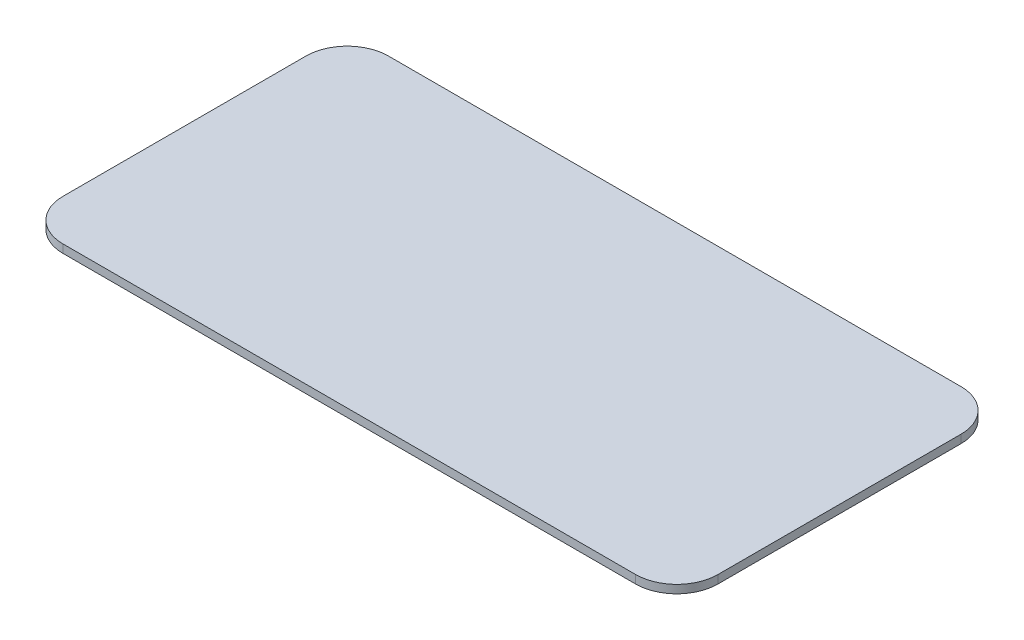
ISO-10303-21;
HEADER;
FILE_DESCRIPTION(('STEP AP214'),'2;1');
FILE_NAME('part.step','',(''),(''),'','','');
FILE_SCHEMA(('AUTOMOTIVE_DESIGN { 1 0 10303 214 1 1 1 1 }'));
ENDSEC;
DATA;
#1=APPLICATION_CONTEXT('core data for automotive mechanical design processes');
#2=APPLICATION_PROTOCOL_DEFINITION('international standard','automotive_design',2000,#1);
#3=PRODUCT_CONTEXT('',#1,'mechanical');
#4=PRODUCT('Part','Part','',(#3));
#5=PRODUCT_RELATED_PRODUCT_CATEGORY('part','',(#4));
#6=PRODUCT_DEFINITION_FORMATION('','',#4);
#7=PRODUCT_DEFINITION_CONTEXT('part definition',#1,'design');
#8=PRODUCT_DEFINITION('design','',#6,#7);
#9=PRODUCT_DEFINITION_SHAPE('','',#8);
#10=(LENGTH_UNIT() NAMED_UNIT(*) SI_UNIT(.MILLI.,.METRE.));
#11=(NAMED_UNIT(*) PLANE_ANGLE_UNIT() SI_UNIT($,.RADIAN.));
#12=(NAMED_UNIT(*) SI_UNIT($,.STERADIAN.) SOLID_ANGLE_UNIT());
#13=UNCERTAINTY_MEASURE_WITH_UNIT(LENGTH_MEASURE(1.E-05),#10,'distance_accuracy_value','');
#14=(GEOMETRIC_REPRESENTATION_CONTEXT(3) GLOBAL_UNCERTAINTY_ASSIGNED_CONTEXT((#13)) GLOBAL_UNIT_ASSIGNED_CONTEXT((#10,
#11,#12)) REPRESENTATION_CONTEXT('',''));
#15=CARTESIAN_POINT('',(0.,0.,0.));
#16=DIRECTION('',(0.,0.,1.));
#17=DIRECTION('',(1.,0.,0.));
#18=AXIS2_PLACEMENT_3D('',#15,#16,#17);
#19=CARTESIAN_POINT('',(-6.95,0.2,2.95));
#20=DIRECTION('',(0.,-1.,0.));
#21=DIRECTION('',(0.,0.,-1.));
#22=AXIS2_PLACEMENT_3D('',#19,#20,#21);
#23=CYLINDRICAL_SURFACE('',#22,1.);
#24=CARTESIAN_POINT('',(-6.95,0.2,2.95));
#25=DIRECTION('',(0.,1.,0.));
#26=DIRECTION('',(0.,0.,-1.));
#27=AXIS2_PLACEMENT_3D('',#24,#25,#26);
#28=CIRCLE('',#27,1.);
#29=CARTESIAN_POINT('',(-7.95,0.2,2.95));
#30=VERTEX_POINT('',#29);
#31=CARTESIAN_POINT('',(-6.95,0.2,3.95));
#32=VERTEX_POINT('',#31);
#33=EDGE_CURVE('E42',#30,#32,#28,.T.);
#34=ORIENTED_EDGE('',*,*,#33,.F.);
#35=DIRECTION('',(0.,1.,0.));
#36=VECTOR('',#35,1.);
#37=CARTESIAN_POINT('',(-7.95,0.2,2.95));
#38=LINE('',#37,#36);
#39=CARTESIAN_POINT('',(-7.95,0.,2.95));
#40=VERTEX_POINT('',#39);
#41=EDGE_CURVE('E107',#40,#30,#38,.T.);
#42=ORIENTED_EDGE('',*,*,#41,.F.);
#43=CARTESIAN_POINT('',(-6.95,0.,2.95));
#44=DIRECTION('',(0.,-1.,0.));
#45=DIRECTION('',(0.,0.,-1.));
#46=AXIS2_PLACEMENT_3D('',#43,#44,#45);
#47=CIRCLE('',#46,1.);
#48=CARTESIAN_POINT('',(-6.95,0.,3.95));
#49=VERTEX_POINT('',#48);
#50=EDGE_CURVE('E102',#49,#40,#47,.T.);
#51=ORIENTED_EDGE('',*,*,#50,.F.);
#52=DIRECTION('',(0.,-1.,0.));
#53=VECTOR('',#52,1.);
#54=CARTESIAN_POINT('',(-6.95,0.2,3.95));
#55=LINE('',#54,#53);
#56=EDGE_CURVE('E104',#32,#49,#55,.T.);
#57=ORIENTED_EDGE('',*,*,#56,.F.);
#58=EDGE_LOOP('',(#34,#42,#51,#57));
#59=FACE_BOUND('',#58,.T.);
#60=ADVANCED_FACE('F16',(#59),#23,.T.);
#61=CARTESIAN_POINT('',(-6.95,0.2,-2.95));
#62=DIRECTION('',(0.,-1.,0.));
#63=DIRECTION('',(0.,0.,-1.));
#64=AXIS2_PLACEMENT_3D('',#61,#62,#63);
#65=CYLINDRICAL_SURFACE('',#64,1.);
#66=CARTESIAN_POINT('',(-6.95,0.2,-2.95));
#67=DIRECTION('',(0.,1.,0.));
#68=DIRECTION('',(0.,0.,-1.));
#69=AXIS2_PLACEMENT_3D('',#66,#67,#68);
#70=CIRCLE('',#69,1.);
#71=CARTESIAN_POINT('',(-6.95,0.2,-3.95));
#72=VERTEX_POINT('',#71);
#73=CARTESIAN_POINT('',(-7.95,0.2,-2.95));
#74=VERTEX_POINT('',#73);
#75=EDGE_CURVE('E80',#72,#74,#70,.T.);
#76=ORIENTED_EDGE('',*,*,#75,.F.);
#77=DIRECTION('',(0.,1.,0.));
#78=VECTOR('',#77,1.);
#79=CARTESIAN_POINT('',(-6.95,0.2,-3.95));
#80=LINE('',#79,#78);
#81=CARTESIAN_POINT('',(-6.95,0.,-3.95));
#82=VERTEX_POINT('',#81);
#83=EDGE_CURVE('E137',#82,#72,#80,.T.);
#84=ORIENTED_EDGE('',*,*,#83,.F.);
#85=CARTESIAN_POINT('',(-6.95,0.,-2.95));
#86=DIRECTION('',(0.,-1.,0.));
#87=DIRECTION('',(0.,0.,-1.));
#88=AXIS2_PLACEMENT_3D('',#85,#86,#87);
#89=CIRCLE('',#88,1.);
#90=CARTESIAN_POINT('',(-7.95,0.,-2.95));
#91=VERTEX_POINT('',#90);
#92=EDGE_CURVE('E27',#91,#82,#89,.T.);
#93=ORIENTED_EDGE('',*,*,#92,.F.);
#94=DIRECTION('',(0.,-1.,0.));
#95=VECTOR('',#94,1.);
#96=CARTESIAN_POINT('',(-7.95,0.2,-2.95));
#97=LINE('',#96,#95);
#98=EDGE_CURVE('E159',#74,#91,#97,.T.);
#99=ORIENTED_EDGE('',*,*,#98,.F.);
#100=EDGE_LOOP('',(#76,#84,#93,#99));
#101=FACE_BOUND('',#100,.T.);
#102=ADVANCED_FACE('F328',(#101),#65,.T.);
#103=CARTESIAN_POINT('',(6.95,0.2,-2.95));
#104=DIRECTION('',(0.,-1.,0.));
#105=DIRECTION('',(0.,0.,-1.));
#106=AXIS2_PLACEMENT_3D('',#103,#104,#105);
#107=CYLINDRICAL_SURFACE('',#106,1.);
#108=CARTESIAN_POINT('',(6.95,0.2,-2.95));
#109=DIRECTION('',(0.,1.,0.));
#110=DIRECTION('',(0.,0.,-1.));
#111=AXIS2_PLACEMENT_3D('',#108,#109,#110);
#112=CIRCLE('',#111,1.);
#113=CARTESIAN_POINT('',(7.95,0.2,-2.95));
#114=VERTEX_POINT('',#113);
#115=CARTESIAN_POINT('',(6.95,0.2,-3.95));
#116=VERTEX_POINT('',#115);
#117=EDGE_CURVE('E166',#114,#116,#112,.T.);
#118=ORIENTED_EDGE('',*,*,#117,.F.);
#119=DIRECTION('',(0.,1.,0.));
#120=VECTOR('',#119,1.);
#121=CARTESIAN_POINT('',(7.95,0.2,-2.95));
#122=LINE('',#121,#120);
#123=CARTESIAN_POINT('',(7.95,0.,-2.95));
#124=VERTEX_POINT('',#123);
#125=EDGE_CURVE('E143',#124,#114,#122,.T.);
#126=ORIENTED_EDGE('',*,*,#125,.F.);
#127=CARTESIAN_POINT('',(6.95,0.,-2.95));
#128=DIRECTION('',(0.,-1.,0.));
#129=DIRECTION('',(0.,0.,-1.));
#130=AXIS2_PLACEMENT_3D('',#127,#128,#129);
#131=CIRCLE('',#130,1.);
#132=CARTESIAN_POINT('',(6.95,0.,-3.95));
#133=VERTEX_POINT('',#132);
#134=EDGE_CURVE('E11',#133,#124,#131,.T.);
#135=ORIENTED_EDGE('',*,*,#134,.F.);
#136=DIRECTION('',(0.,-1.,0.));
#137=VECTOR('',#136,1.);
#138=CARTESIAN_POINT('',(6.95,0.2,-3.95));
#139=LINE('',#138,#137);
#140=EDGE_CURVE('E153',#116,#133,#139,.T.);
#141=ORIENTED_EDGE('',*,*,#140,.F.);
#142=EDGE_LOOP('',(#118,#126,#135,#141));
#143=FACE_BOUND('',#142,.T.);
#144=ADVANCED_FACE('F317',(#143),#107,.T.);
#145=CARTESIAN_POINT('',(6.95,0.2,2.95));
#146=DIRECTION('',(0.,-1.,0.));
#147=DIRECTION('',(0.,0.,-1.));
#148=AXIS2_PLACEMENT_3D('',#145,#146,#147);
#149=CYLINDRICAL_SURFACE('',#148,1.);
#150=CARTESIAN_POINT('',(6.95,0.2,2.95));
#151=DIRECTION('',(0.,1.,0.));
#152=DIRECTION('',(0.,0.,-1.));
#153=AXIS2_PLACEMENT_3D('',#150,#151,#152);
#154=CIRCLE('',#153,1.);
#155=CARTESIAN_POINT('',(6.95,0.2,3.95));
#156=VERTEX_POINT('',#155);
#157=CARTESIAN_POINT('',(7.95,0.2,2.95));
#158=VERTEX_POINT('',#157);
#159=EDGE_CURVE('E120',#156,#158,#154,.T.);
#160=ORIENTED_EDGE('',*,*,#159,.F.);
#161=DIRECTION('',(0.,1.,0.));
#162=VECTOR('',#161,1.);
#163=CARTESIAN_POINT('',(6.95,0.2,3.95));
#164=LINE('',#163,#162);
#165=CARTESIAN_POINT('',(6.95,0.,3.95));
#166=VERTEX_POINT('',#165);
#167=EDGE_CURVE('E127',#166,#156,#164,.T.);
#168=ORIENTED_EDGE('',*,*,#167,.F.);
#169=CARTESIAN_POINT('',(6.95,0.,2.95));
#170=DIRECTION('',(0.,-1.,0.));
#171=DIRECTION('',(0.,0.,-1.));
#172=AXIS2_PLACEMENT_3D('',#169,#170,#171);
#173=CIRCLE('',#172,1.);
#174=CARTESIAN_POINT('',(7.95,0.,2.95));
#175=VERTEX_POINT('',#174);
#176=EDGE_CURVE('E111',#175,#166,#173,.T.);
#177=ORIENTED_EDGE('',*,*,#176,.F.);
#178=DIRECTION('',(0.,-1.,0.));
#179=VECTOR('',#178,1.);
#180=CARTESIAN_POINT('',(7.95,0.2,2.95));
#181=LINE('',#180,#179);
#182=EDGE_CURVE('E20',#158,#175,#181,.T.);
#183=ORIENTED_EDGE('',*,*,#182,.F.);
#184=EDGE_LOOP('',(#160,#168,#177,#183));
#185=FACE_BOUND('',#184,.T.);
#186=ADVANCED_FACE('F308',(#185),#149,.T.);
#187=CARTESIAN_POINT('',(0.,0.,0.));
#188=DIRECTION('',(0.,-1.,0.));
#189=DIRECTION('',(0.,0.,-1.));
#190=AXIS2_PLACEMENT_3D('',#187,#188,#189);
#191=PLANE('',#190);
#192=DIRECTION('',(0.,0.,-1.));
#193=VECTOR('',#192,1.);
#194=CARTESIAN_POINT('',(7.95,0.,3.95));
#195=LINE('',#194,#193);
#196=EDGE_CURVE('E148',#175,#124,#195,.T.);
#197=ORIENTED_EDGE('',*,*,#196,.F.);
#198=ORIENTED_EDGE('',*,*,#176,.T.);
#199=DIRECTION('',(1.,0.,0.));
#200=VECTOR('',#199,1.);
#201=CARTESIAN_POINT('',(-7.95,0.,3.95));
#202=LINE('',#201,#200);
#203=EDGE_CURVE('E117',#49,#166,#202,.T.);
#204=ORIENTED_EDGE('',*,*,#203,.F.);
#205=ORIENTED_EDGE('',*,*,#50,.T.);
#206=DIRECTION('',(0.,0.,1.));
#207=VECTOR('',#206,1.);
#208=CARTESIAN_POINT('',(-7.95,0.,3.95));
#209=LINE('',#208,#207);
#210=EDGE_CURVE('E134',#91,#40,#209,.T.);
#211=ORIENTED_EDGE('',*,*,#210,.F.);
#212=ORIENTED_EDGE('',*,*,#92,.T.);
#213=DIRECTION('',(-1.,0.,0.));
#214=VECTOR('',#213,1.);
#215=CARTESIAN_POINT('',(-7.95,0.,-3.95));
#216=LINE('',#215,#214);
#217=EDGE_CURVE('E142',#133,#82,#216,.T.);
#218=ORIENTED_EDGE('',*,*,#217,.F.);
#219=ORIENTED_EDGE('',*,*,#134,.T.);
#220=EDGE_LOOP('',(#197,#198,#204,#205,#211,#212,#218,#219));
#221=FACE_BOUND('',#220,.T.);
#222=ADVANCED_FACE('F123',(#221),#191,.T.);
#223=CARTESIAN_POINT('',(0.,0.2,0.));
#224=DIRECTION('',(0.,-1.,0.));
#225=DIRECTION('',(0.,0.,-1.));
#226=AXIS2_PLACEMENT_3D('',#223,#224,#225);
#227=PLANE('',#226);
#228=DIRECTION('',(1.,0.,0.));
#229=VECTOR('',#228,1.);
#230=CARTESIAN_POINT('',(-7.95,0.2,3.95));
#231=LINE('',#230,#229);
#232=EDGE_CURVE('E118',#32,#156,#231,.T.);
#233=ORIENTED_EDGE('',*,*,#232,.T.);
#234=ORIENTED_EDGE('',*,*,#159,.T.);
#235=DIRECTION('',(0.,0.,-1.));
#236=VECTOR('',#235,1.);
#237=CARTESIAN_POINT('',(7.95,0.2,3.95));
#238=LINE('',#237,#236);
#239=EDGE_CURVE('E149',#158,#114,#238,.T.);
#240=ORIENTED_EDGE('',*,*,#239,.T.);
#241=ORIENTED_EDGE('',*,*,#117,.T.);
#242=DIRECTION('',(-1.,0.,0.));
#243=VECTOR('',#242,1.);
#244=CARTESIAN_POINT('',(-7.95,0.2,-3.95));
#245=LINE('',#244,#243);
#246=EDGE_CURVE('E147',#116,#72,#245,.T.);
#247=ORIENTED_EDGE('',*,*,#246,.T.);
#248=ORIENTED_EDGE('',*,*,#75,.T.);
#249=DIRECTION('',(0.,0.,1.));
#250=VECTOR('',#249,1.);
#251=CARTESIAN_POINT('',(-7.95,0.2,3.95));
#252=LINE('',#251,#250);
#253=EDGE_CURVE('E141',#74,#30,#252,.T.);
#254=ORIENTED_EDGE('',*,*,#253,.T.);
#255=ORIENTED_EDGE('',*,*,#33,.T.);
#256=EDGE_LOOP('',(#233,#234,#240,#241,#247,#248,#254,#255));
#257=FACE_BOUND('',#256,.T.);
#258=ADVANCED_FACE('F18',(#257),#227,.F.);
#259=CARTESIAN_POINT('',(-7.95,0.2,3.95));
#260=DIRECTION('',(0.,0.,-1.));
#261=DIRECTION('',(0.,-1.,0.));
#262=AXIS2_PLACEMENT_3D('',#259,#260,#261);
#263=PLANE('',#262);
#264=ORIENTED_EDGE('',*,*,#203,.T.);
#265=ORIENTED_EDGE('',*,*,#167,.T.);
#266=ORIENTED_EDGE('',*,*,#232,.F.);
#267=ORIENTED_EDGE('',*,*,#56,.T.);
#268=EDGE_LOOP('',(#264,#265,#266,#267));
#269=FACE_BOUND('',#268,.T.);
#270=ADVANCED_FACE('F115',(#269),#263,.F.);
#271=CARTESIAN_POINT('',(-7.95,0.2,3.95));
#272=DIRECTION('',(1.,0.,0.));
#273=DIRECTION('',(0.,1.,0.));
#274=AXIS2_PLACEMENT_3D('',#271,#272,#273);
#275=PLANE('',#274);
#276=ORIENTED_EDGE('',*,*,#253,.F.);
#277=ORIENTED_EDGE('',*,*,#98,.T.);
#278=ORIENTED_EDGE('',*,*,#210,.T.);
#279=ORIENTED_EDGE('',*,*,#41,.T.);
#280=EDGE_LOOP('',(#276,#277,#278,#279));
#281=FACE_BOUND('',#280,.T.);
#282=ADVANCED_FACE('F263',(#281),#275,.F.);
#283=CARTESIAN_POINT('',(-7.95,0.2,-3.95));
#284=DIRECTION('',(0.,0.,1.));
#285=DIRECTION('',(1.,0.,0.));
#286=AXIS2_PLACEMENT_3D('',#283,#284,#285);
#287=PLANE('',#286);
#288=ORIENTED_EDGE('',*,*,#246,.F.);
#289=ORIENTED_EDGE('',*,*,#140,.T.);
#290=ORIENTED_EDGE('',*,*,#217,.T.);
#291=ORIENTED_EDGE('',*,*,#83,.T.);
#292=EDGE_LOOP('',(#288,#289,#290,#291));
#293=FACE_BOUND('',#292,.T.);
#294=ADVANCED_FACE('F249',(#293),#287,.F.);
#295=CARTESIAN_POINT('',(7.95,0.2,3.95));
#296=DIRECTION('',(-1.,0.,0.));
#297=DIRECTION('',(0.,0.,1.));
#298=AXIS2_PLACEMENT_3D('',#295,#296,#297);
#299=PLANE('',#298);
#300=ORIENTED_EDGE('',*,*,#239,.F.);
#301=ORIENTED_EDGE('',*,*,#182,.T.);
#302=ORIENTED_EDGE('',*,*,#196,.T.);
#303=ORIENTED_EDGE('',*,*,#125,.T.);
#304=EDGE_LOOP('',(#300,#301,#302,#303));
#305=FACE_BOUND('',#304,.T.);
#306=ADVANCED_FACE('F243',(#305),#299,.F.);
#307=CLOSED_SHELL('',(#60,#102,#144,#186,#222,#258,#270,#282,#294,#306));
#308=MANIFOLD_SOLID_BREP('B1',#307);
#309=ADVANCED_BREP_SHAPE_REPRESENTATION('',(#18,#308),#14);
#310=SHAPE_DEFINITION_REPRESENTATION(#9,#309);
ENDSEC;
END-ISO-10303-21;
